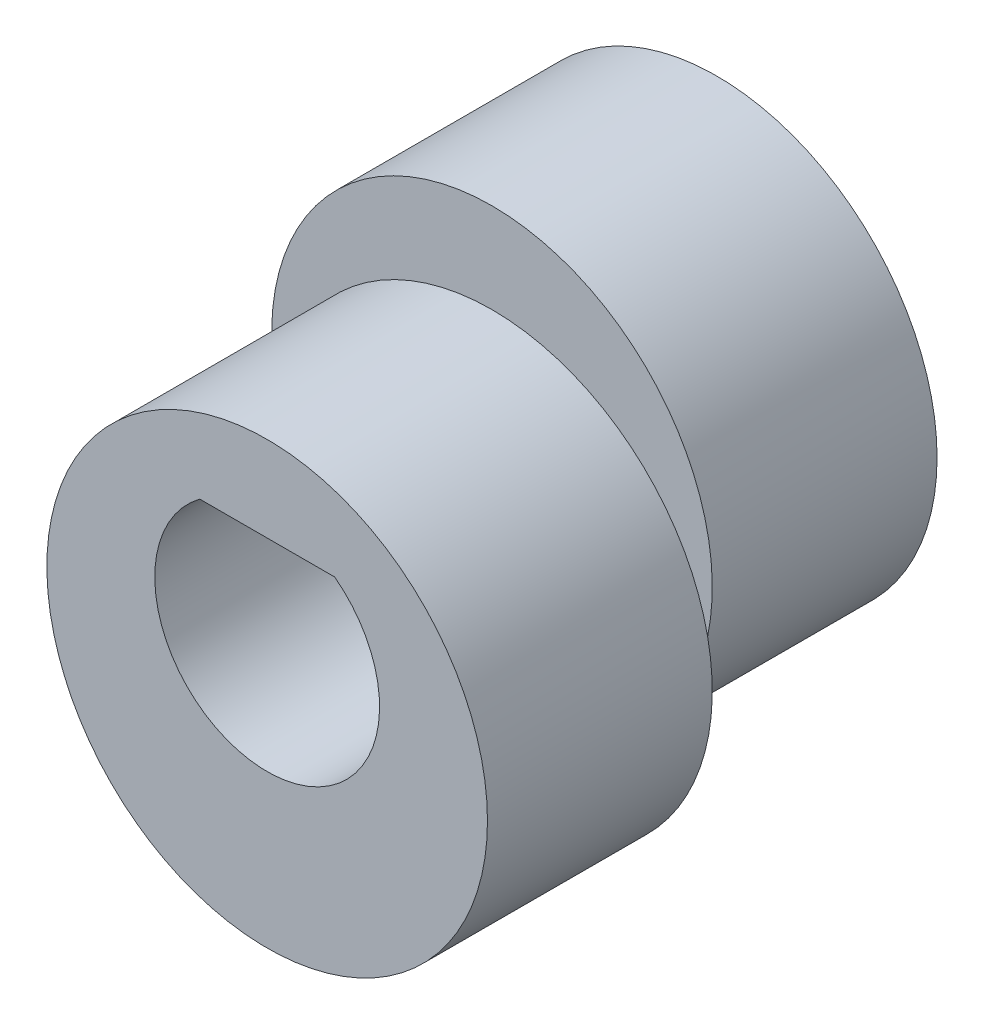
ISO-10303-21;
HEADER;
FILE_DESCRIPTION(('STEP AP214'),'2;1');
FILE_NAME('part.step','',(''),(''),'','','');
FILE_SCHEMA(('AUTOMOTIVE_DESIGN { 1 0 10303 214 1 1 1 1 }'));
ENDSEC;
DATA;
#1=APPLICATION_CONTEXT('core data for automotive mechanical design processes');
#2=APPLICATION_PROTOCOL_DEFINITION('international standard','automotive_design',2000,#1);
#3=PRODUCT_CONTEXT('',#1,'mechanical');
#4=PRODUCT('Part','Part','',(#3));
#5=PRODUCT_RELATED_PRODUCT_CATEGORY('part','',(#4));
#6=PRODUCT_DEFINITION_FORMATION('','',#4);
#7=PRODUCT_DEFINITION_CONTEXT('part definition',#1,'design');
#8=PRODUCT_DEFINITION('design','',#6,#7);
#9=PRODUCT_DEFINITION_SHAPE('','',#8);
#10=(LENGTH_UNIT() NAMED_UNIT(*) SI_UNIT(.MILLI.,.METRE.));
#11=(NAMED_UNIT(*) PLANE_ANGLE_UNIT() SI_UNIT($,.RADIAN.));
#12=(NAMED_UNIT(*) SI_UNIT($,.STERADIAN.) SOLID_ANGLE_UNIT());
#13=UNCERTAINTY_MEASURE_WITH_UNIT(LENGTH_MEASURE(1.E-05),#10,'distance_accuracy_value','');
#14=(GEOMETRIC_REPRESENTATION_CONTEXT(3) GLOBAL_UNCERTAINTY_ASSIGNED_CONTEXT((#13)) GLOBAL_UNIT_ASSIGNED_CONTEXT((#10,
#11,#12)) REPRESENTATION_CONTEXT('',''));
#15=CARTESIAN_POINT('',(0.,0.,0.));
#16=DIRECTION('',(0.,0.,1.));
#17=DIRECTION('',(1.,0.,0.));
#18=AXIS2_PLACEMENT_3D('',#15,#16,#17);
#19=CARTESIAN_POINT('',(0.,0.,5.));
#20=DIRECTION('',(0.,0.,-1.));
#21=DIRECTION('',(-1.,0.,0.));
#22=AXIS2_PLACEMENT_3D('',#19,#20,#21);
#23=CYLINDRICAL_SURFACE('',#22,2.5);
#24=CARTESIAN_POINT('',(0.,0.,0.));
#25=DIRECTION('',(0.,0.,1.));
#26=DIRECTION('',(1.,0.,0.));
#27=AXIS2_PLACEMENT_3D('',#24,#25,#26);
#28=CIRCLE('',#27,2.5);
#29=CARTESIAN_POINT('',(-1.5,2.,0.));
#30=VERTEX_POINT('',#29);
#31=CARTESIAN_POINT('',(1.5,2.,0.));
#32=VERTEX_POINT('',#31);
#33=EDGE_CURVE('E71',#30,#32,#28,.T.);
#34=ORIENTED_EDGE('',*,*,#33,.F.);
#35=DIRECTION('',(0.,0.,-1.));
#36=VECTOR('',#35,1.);
#37=CARTESIAN_POINT('',(-1.5,2.,5.));
#38=LINE('',#37,#36);
#39=CARTESIAN_POINT('',(-1.5,2.,10.));
#40=VERTEX_POINT('',#39);
#41=EDGE_CURVE('E11',#40,#30,#38,.T.);
#42=ORIENTED_EDGE('',*,*,#41,.F.);
#43=CARTESIAN_POINT('',(0.,0.,10.));
#44=DIRECTION('',(0.,0.,1.));
#45=DIRECTION('',(1.,0.,0.));
#46=AXIS2_PLACEMENT_3D('',#43,#44,#45);
#47=CIRCLE('',#46,2.5);
#48=CARTESIAN_POINT('',(1.5,2.,10.));
#49=VERTEX_POINT('',#48);
#50=EDGE_CURVE('E68',#40,#49,#47,.T.);
#51=ORIENTED_EDGE('',*,*,#50,.T.);
#52=DIRECTION('',(0.,0.,-1.));
#53=VECTOR('',#52,1.);
#54=CARTESIAN_POINT('',(1.5,2.,5.));
#55=LINE('',#54,#53);
#56=EDGE_CURVE('E42',#49,#32,#55,.T.);
#57=ORIENTED_EDGE('',*,*,#56,.T.);
#58=EDGE_LOOP('',(#34,#42,#51,#57));
#59=FACE_BOUND('',#58,.T.);
#60=ADVANCED_FACE('F35',(#59),#23,.F.);
#61=CARTESIAN_POINT('',(0.,2.,5.));
#62=DIRECTION('',(0.,1.,0.));
#63=DIRECTION('',(0.,0.,1.));
#64=AXIS2_PLACEMENT_3D('',#61,#62,#63);
#65=PLANE('',#64);
#66=DIRECTION('',(1.,0.,0.));
#67=VECTOR('',#66,1.);
#68=CARTESIAN_POINT('',(0.,2.,0.));
#69=LINE('',#68,#67);
#70=EDGE_CURVE('E91',#30,#32,#69,.T.);
#71=ORIENTED_EDGE('',*,*,#70,.T.);
#72=ORIENTED_EDGE('',*,*,#56,.F.);
#73=DIRECTION('',(-1.,0.,0.));
#74=VECTOR('',#73,1.);
#75=CARTESIAN_POINT('',(-1.5,2.,10.));
#76=LINE('',#75,#74);
#77=EDGE_CURVE('E74',#49,#40,#76,.T.);
#78=ORIENTED_EDGE('',*,*,#77,.T.);
#79=ORIENTED_EDGE('',*,*,#41,.T.);
#80=EDGE_LOOP('',(#71,#72,#78,#79));
#81=FACE_BOUND('',#80,.T.);
#82=ADVANCED_FACE('F75',(#81),#65,.F.);
#83=CARTESIAN_POINT('',(0.,1.,5.));
#84=DIRECTION('',(0.,0.,-1.));
#85=DIRECTION('',(-1.,0.,0.));
#86=AXIS2_PLACEMENT_3D('',#83,#84,#85);
#87=CYLINDRICAL_SURFACE('',#86,4.9);
#88=CARTESIAN_POINT('',(0.,1.,5.));
#89=DIRECTION('',(0.,0.,1.));
#90=DIRECTION('',(1.,0.,0.));
#91=AXIS2_PLACEMENT_3D('',#88,#89,#90);
#92=CIRCLE('',#91,4.9);
#93=CARTESIAN_POINT('',(-4.79687398208458,0.,5.));
#94=VERTEX_POINT('',#93);
#95=CARTESIAN_POINT('',(4.79687398208458,0.,5.));
#96=VERTEX_POINT('',#95);
#97=EDGE_CURVE('E86',#94,#96,#92,.T.);
#98=ORIENTED_EDGE('',*,*,#97,.F.);
#99=EDGE_CURVE('E89',#96,#94,#92,.T.);
#100=ORIENTED_EDGE('',*,*,#99,.F.);
#101=EDGE_LOOP('',(#98,#100));
#102=FACE_BOUND('',#101,.T.);
#103=CARTESIAN_POINT('',(0.,1.,0.));
#104=DIRECTION('',(0.,0.,1.));
#105=DIRECTION('',(1.,0.,0.));
#106=AXIS2_PLACEMENT_3D('',#103,#104,#105);
#107=CIRCLE('',#106,4.9);
#108=CARTESIAN_POINT('',(4.9,1.,0.));
#109=VERTEX_POINT('',#108);
#110=EDGE_CURVE('E93',#109,#109,#107,.T.);
#111=ORIENTED_EDGE('',*,*,#110,.T.);
#112=EDGE_LOOP('',(#111));
#113=FACE_BOUND('',#112,.T.);
#114=ADVANCED_FACE('F120',(#102,#113),#87,.T.);
#115=CARTESIAN_POINT('',(0.,0.,5.));
#116=DIRECTION('',(0.,0.,1.));
#117=DIRECTION('',(1.,0.,0.));
#118=AXIS2_PLACEMENT_3D('',#115,#116,#117);
#119=PLANE('',#118);
#120=CARTESIAN_POINT('',(0.,-1.,5.));
#121=DIRECTION('',(0.,0.,1.));
#122=DIRECTION('',(1.,0.,0.));
#123=AXIS2_PLACEMENT_3D('',#120,#121,#122);
#124=CIRCLE('',#123,4.9);
#125=EDGE_CURVE('E48',#96,#94,#124,.T.);
#126=ORIENTED_EDGE('',*,*,#125,.F.);
#127=ORIENTED_EDGE('',*,*,#99,.T.);
#128=EDGE_LOOP('',(#126,#127));
#129=FACE_BOUND('',#128,.T.);
#130=ADVANCED_FACE('F98',(#129),#119,.T.);
#131=CARTESIAN_POINT('',(0.,0.,0.));
#132=DIRECTION('',(0.,0.,1.));
#133=DIRECTION('',(1.,0.,0.));
#134=AXIS2_PLACEMENT_3D('',#131,#132,#133);
#135=PLANE('',#134);
#136=ORIENTED_EDGE('',*,*,#33,.T.);
#137=ORIENTED_EDGE('',*,*,#70,.F.);
#138=EDGE_LOOP('',(#136,#137));
#139=FACE_BOUND('',#138,.T.);
#140=ORIENTED_EDGE('',*,*,#110,.F.);
#141=EDGE_LOOP('',(#140));
#142=FACE_BOUND('',#141,.T.);
#143=ADVANCED_FACE('F126',(#139,#142),#135,.F.);
#144=CARTESIAN_POINT('',(0.,-1.,5.));
#145=DIRECTION('',(0.,0.,1.));
#146=DIRECTION('',(1.,0.,0.));
#147=AXIS2_PLACEMENT_3D('',#144,#145,#146);
#148=PLANE('',#147);
#149=EDGE_CURVE('E77',#94,#96,#124,.T.);
#150=ORIENTED_EDGE('',*,*,#149,.F.);
#151=ORIENTED_EDGE('',*,*,#97,.T.);
#152=EDGE_LOOP('',(#150,#151));
#153=FACE_BOUND('',#152,.T.);
#154=ADVANCED_FACE('F102',(#153),#148,.F.);
#155=CARTESIAN_POINT('',(0.,-1.,10.));
#156=DIRECTION('',(0.,0.,1.));
#157=DIRECTION('',(1.,0.,0.));
#158=AXIS2_PLACEMENT_3D('',#155,#156,#157);
#159=PLANE('',#158);
#160=CARTESIAN_POINT('',(0.,-1.,10.));
#161=DIRECTION('',(0.,0.,1.));
#162=DIRECTION('',(1.,0.,0.));
#163=AXIS2_PLACEMENT_3D('',#160,#161,#162);
#164=CIRCLE('',#163,4.9);
#165=CARTESIAN_POINT('',(4.9,-1.,10.));
#166=VERTEX_POINT('',#165);
#167=EDGE_CURVE('E82',#166,#166,#164,.T.);
#168=ORIENTED_EDGE('',*,*,#167,.T.);
#169=EDGE_LOOP('',(#168));
#170=FACE_BOUND('',#169,.T.);
#171=ORIENTED_EDGE('',*,*,#77,.F.);
#172=ORIENTED_EDGE('',*,*,#50,.F.);
#173=EDGE_LOOP('',(#171,#172));
#174=FACE_BOUND('',#173,.T.);
#175=ADVANCED_FACE('F79',(#170,#174),#159,.T.);
#176=CARTESIAN_POINT('',(0.,-1.,10.));
#177=DIRECTION('',(0.,0.,-1.));
#178=DIRECTION('',(-1.,0.,0.));
#179=AXIS2_PLACEMENT_3D('',#176,#177,#178);
#180=CYLINDRICAL_SURFACE('',#179,4.9);
#181=ORIENTED_EDGE('',*,*,#167,.F.);
#182=EDGE_LOOP('',(#181));
#183=FACE_BOUND('',#182,.T.);
#184=ORIENTED_EDGE('',*,*,#125,.T.);
#185=ORIENTED_EDGE('',*,*,#149,.T.);
#186=EDGE_LOOP('',(#184,#185));
#187=FACE_BOUND('',#186,.T.);
#188=ADVANCED_FACE('F104',(#183,#187),#180,.T.);
#189=CLOSED_SHELL('',(#60,#82,#114,#130,#143,#154,#175,#188));
#190=MANIFOLD_SOLID_BREP('B2',#189);
#191=ADVANCED_BREP_SHAPE_REPRESENTATION('',(#18,#190),#14);
#192=SHAPE_DEFINITION_REPRESENTATION(#9,#191);
ENDSEC;
END-ISO-10303-21;
